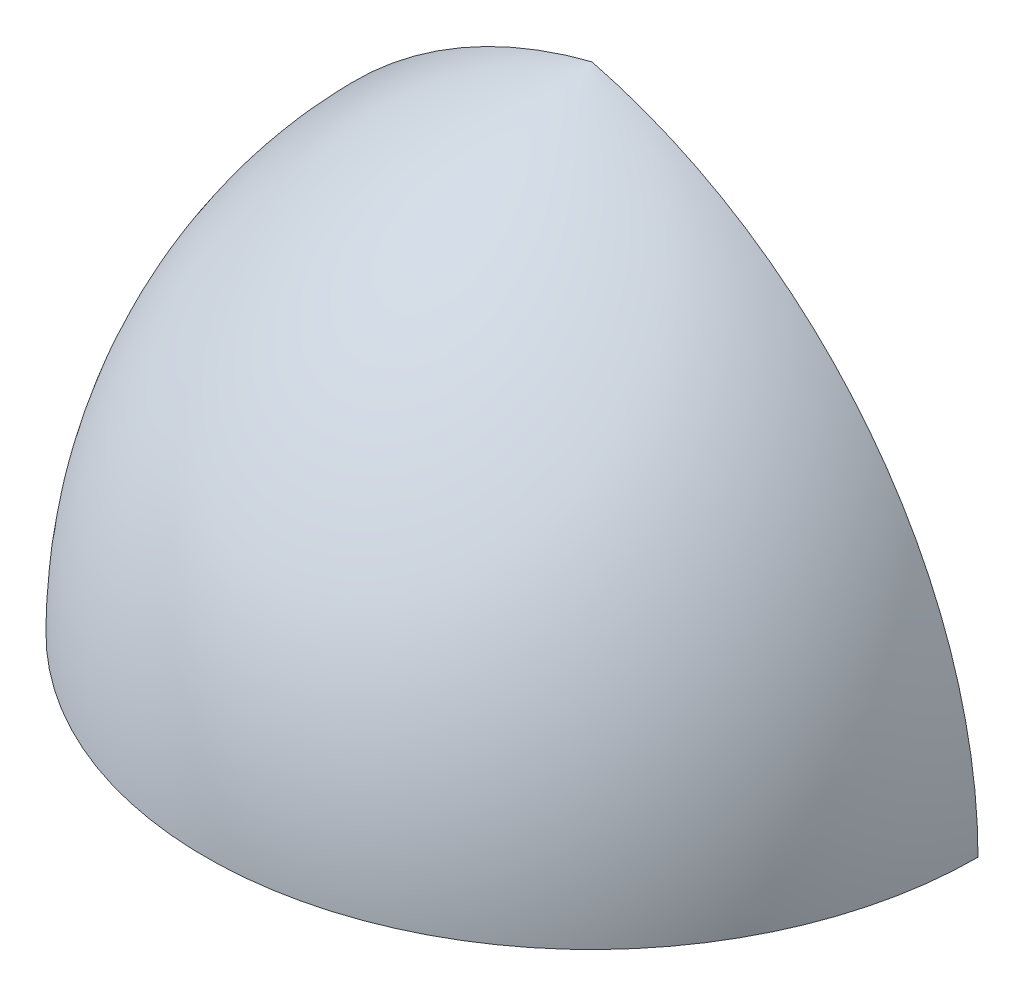
ISO-10303-21;
HEADER;
FILE_DESCRIPTION(('STEP AP214'),'2;1');
FILE_NAME('part.step','',(''),(''),'','','');
FILE_SCHEMA(('AUTOMOTIVE_DESIGN { 1 0 10303 214 1 1 1 1 }'));
ENDSEC;
DATA;
#1=APPLICATION_CONTEXT('core data for automotive mechanical design processes');
#2=APPLICATION_PROTOCOL_DEFINITION('international standard','automotive_design',2000,#1);
#3=PRODUCT_CONTEXT('',#1,'mechanical');
#4=PRODUCT('Part','Part','',(#3));
#5=PRODUCT_RELATED_PRODUCT_CATEGORY('part','',(#4));
#6=PRODUCT_DEFINITION_FORMATION('','',#4);
#7=PRODUCT_DEFINITION_CONTEXT('part definition',#1,'design');
#8=PRODUCT_DEFINITION('design','',#6,#7);
#9=PRODUCT_DEFINITION_SHAPE('','',#8);
#10=(LENGTH_UNIT() NAMED_UNIT(*) SI_UNIT(.MILLI.,.METRE.));
#11=(NAMED_UNIT(*) PLANE_ANGLE_UNIT() SI_UNIT($,.RADIAN.));
#12=(NAMED_UNIT(*) SI_UNIT($,.STERADIAN.) SOLID_ANGLE_UNIT());
#13=UNCERTAINTY_MEASURE_WITH_UNIT(LENGTH_MEASURE(1.E-05),#10,'distance_accuracy_value','');
#14=(GEOMETRIC_REPRESENTATION_CONTEXT(3) GLOBAL_UNCERTAINTY_ASSIGNED_CONTEXT((#13)) GLOBAL_UNIT_ASSIGNED_CONTEXT((#10,
#11,#12)) REPRESENTATION_CONTEXT('',''));
#15=CARTESIAN_POINT('',(0.,0.,0.));
#16=DIRECTION('',(0.,0.,1.));
#17=DIRECTION('',(1.,0.,0.));
#18=AXIS2_PLACEMENT_3D('',#15,#16,#17);
#19=CARTESIAN_POINT('',(0.,0.,0.));
#20=DIRECTION('',(0.,1.,0.));
#21=DIRECTION('',(0.,0.,1.));
#22=AXIS2_PLACEMENT_3D('',#19,#20,#21);
#23=PLANE('',#22);
#24=CARTESIAN_POINT('',(0.,0.,0.));
#25=DIRECTION('',(0.,-1.,0.));
#26=DIRECTION('',(0.,0.,-1.));
#27=AXIS2_PLACEMENT_3D('',#24,#25,#26);
#28=CIRCLE('',#27,302.5);
#29=CARTESIAN_POINT('',(302.5,0.,-2.1123462100001E-12));
#30=VERTEX_POINT('',#29);
#31=CARTESIAN_POINT('',(-302.5,0.,0.));
#32=VERTEX_POINT('',#31);
#33=EDGE_CURVE('E11',#30,#32,#28,.T.);
#34=ORIENTED_EDGE('',*,*,#33,.T.);
#35=DIRECTION('',(-1.,0.,0.));
#36=VECTOR('',#35,1.);
#37=CARTESIAN_POINT('',(0.,0.,0.));
#38=LINE('',#37,#36);
#39=EDGE_CURVE('E62',#30,#32,#38,.T.);
#40=ORIENTED_EDGE('',*,*,#39,.F.);
#41=EDGE_LOOP('',(#34,#40));
#42=FACE_BOUND('',#41,.T.);
#43=ADVANCED_FACE('F39',(#42),#23,.F.);
#44=CARTESIAN_POINT('',(0.,0.,98.2247933884299));
#45=DIRECTION('',(-1.,0.,0.));
#46=DIRECTION('',(0.,0.,-1.));
#47=AXIS2_PLACEMENT_3D('',#44,#45,#46);
#48=CIRCLE('',#47,400.72479338843);
#49=TRIMMED_CURVE('',#48,(PARAMETER_VALUE(-1.32315509427937)),
(PARAMETER_VALUE(1.32315509427937)),.T.,.PARAMETER.);
#50=CARTESIAN_POINT('',(0.,0.,0.));
#51=DIRECTION('',(0.,-1.,0.));
#52=AXIS1_PLACEMENT('',#50,#51);
#53=SURFACE_OF_REVOLUTION('',#49,#52);
#54=CARTESIAN_POINT('',(98.2247933884299,0.,0.));
#55=DIRECTION('',(0.,0.,1.));
#56=DIRECTION('',(-1.,0.,0.));
#57=AXIS2_PLACEMENT_3D('',#54,#55,#56);
#58=CIRCLE('',#57,400.72479338843);
#59=CARTESIAN_POINT('',(0.,388.5,0.));
#60=VERTEX_POINT('',#59);
#61=EDGE_CURVE('E59',#60,#32,#58,.T.);
#62=ORIENTED_EDGE('',*,*,#61,.T.);
#63=ORIENTED_EDGE('',*,*,#33,.F.);
#64=CARTESIAN_POINT('',(-98.2247933884299,0.,6.85900066254851E-13));
#65=DIRECTION('',(0.,0.,-1.));
#66=DIRECTION('',(1.,0.,0.));
#67=AXIS2_PLACEMENT_3D('',#64,#65,#66);
#68=CIRCLE('',#67,400.72479338843);
#69=EDGE_CURVE('E48',#60,#30,#68,.T.);
#70=ORIENTED_EDGE('',*,*,#69,.F.);
#71=EDGE_LOOP('',(#62,#63,#70));
#72=FACE_BOUND('',#71,.T.);
#73=ADVANCED_FACE('F41',(#72),#53,.T.);
#74=CARTESIAN_POINT('',(-98.2247933884299,0.,6.85900066254851E-13));
#75=DIRECTION('',(0.,0.,1.));
#76=DIRECTION('',(1.,0.,0.));
#77=AXIS2_PLACEMENT_3D('',#74,#75,#76);
#78=PLANE('',#77);
#79=ORIENTED_EDGE('',*,*,#39,.T.);
#80=ORIENTED_EDGE('',*,*,#61,.F.);
#81=ORIENTED_EDGE('',*,*,#69,.T.);
#82=EDGE_LOOP('',(#79,#80,#81));
#83=FACE_BOUND('',#82,.T.);
#84=ADVANCED_FACE('F63',(#83),#78,.F.);
#85=CLOSED_SHELL('',(#43,#73,#84));
#86=MANIFOLD_SOLID_BREP('B2',#85);
#87=ADVANCED_BREP_SHAPE_REPRESENTATION('',(#18,#86),#14);
#88=SHAPE_DEFINITION_REPRESENTATION(#9,#87);
ENDSEC;
END-ISO-10303-21;
